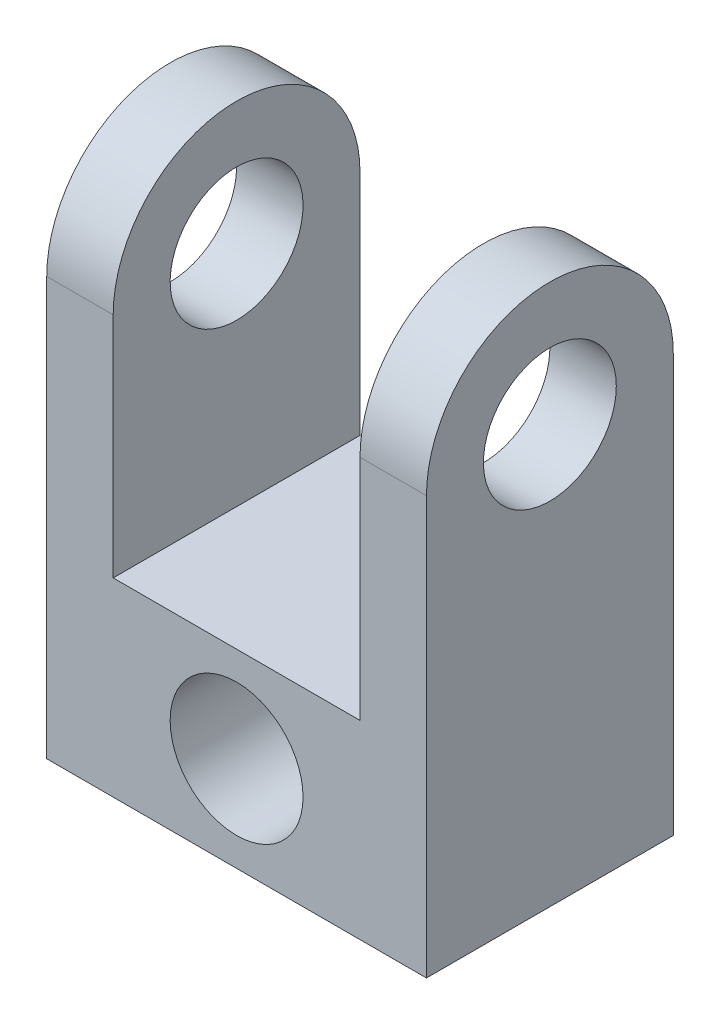
ISO-10303-21;
HEADER;
FILE_DESCRIPTION(('STEP AP214'),'2;1');
FILE_NAME('part.step','',(''),(''),'','','');
FILE_SCHEMA(('AUTOMOTIVE_DESIGN { 1 0 10303 214 1 1 1 1 }'));
ENDSEC;
DATA;
#1=APPLICATION_CONTEXT('core data for automotive mechanical design processes');
#2=APPLICATION_PROTOCOL_DEFINITION('international standard','automotive_design',2000,#1);
#3=PRODUCT_CONTEXT('',#1,'mechanical');
#4=PRODUCT('Part','Part','',(#3));
#5=PRODUCT_RELATED_PRODUCT_CATEGORY('part','',(#4));
#6=PRODUCT_DEFINITION_FORMATION('','',#4);
#7=PRODUCT_DEFINITION_CONTEXT('part definition',#1,'design');
#8=PRODUCT_DEFINITION('design','',#6,#7);
#9=PRODUCT_DEFINITION_SHAPE('','',#8);
#10=(LENGTH_UNIT() NAMED_UNIT(*) SI_UNIT(.MILLI.,.METRE.));
#11=(NAMED_UNIT(*) PLANE_ANGLE_UNIT() SI_UNIT($,.RADIAN.));
#12=(NAMED_UNIT(*) SI_UNIT($,.STERADIAN.) SOLID_ANGLE_UNIT());
#13=UNCERTAINTY_MEASURE_WITH_UNIT(LENGTH_MEASURE(1.E-05),#10,'distance_accuracy_value','');
#14=(GEOMETRIC_REPRESENTATION_CONTEXT(3) GLOBAL_UNCERTAINTY_ASSIGNED_CONTEXT((#13)) GLOBAL_UNIT_ASSIGNED_CONTEXT((#10,
#11,#12)) REPRESENTATION_CONTEXT('',''));
#15=CARTESIAN_POINT('',(0.,0.,0.));
#16=DIRECTION('',(0.,0.,1.));
#17=DIRECTION('',(1.,0.,0.));
#18=AXIS2_PLACEMENT_3D('',#15,#16,#17);
#19=CARTESIAN_POINT('',(10.,0.,0.));
#20=DIRECTION('',(-1.,0.,0.));
#21=DIRECTION('',(0.,0.,1.));
#22=AXIS2_PLACEMENT_3D('',#19,#20,#21);
#23=CYLINDRICAL_SURFACE('',#22,6.5);
#24=CARTESIAN_POINT('',(-6.5,0.,0.));
#25=DIRECTION('',(-1.,0.,0.));
#26=DIRECTION('',(0.,-1.,0.));
#27=AXIS2_PLACEMENT_3D('',#24,#25,#26);
#28=CIRCLE('',#27,6.5);
#29=CARTESIAN_POINT('',(-6.5,0.,6.5));
#30=VERTEX_POINT('',#29);
#31=CARTESIAN_POINT('',(-6.5,0.,-6.5));
#32=VERTEX_POINT('',#31);
#33=EDGE_CURVE('E136',#30,#32,#28,.T.);
#34=ORIENTED_EDGE('',*,*,#33,.T.);
#35=DIRECTION('',(-1.,0.,0.));
#36=VECTOR('',#35,1.);
#37=CARTESIAN_POINT('',(10.,0.,-6.5));
#38=LINE('',#37,#36);
#39=CARTESIAN_POINT('',(-10.,0.,-6.5));
#40=VERTEX_POINT('',#39);
#41=EDGE_CURVE('E79',#32,#40,#38,.T.);
#42=ORIENTED_EDGE('',*,*,#41,.T.);
#43=CARTESIAN_POINT('',(-10.,0.,0.));
#44=DIRECTION('',(1.,0.,0.));
#45=DIRECTION('',(0.,0.,-1.));
#46=AXIS2_PLACEMENT_3D('',#43,#44,#45);
#47=CIRCLE('',#46,6.5);
#48=CARTESIAN_POINT('',(-10.,0.,6.5));
#49=VERTEX_POINT('',#48);
#50=EDGE_CURVE('E146',#40,#49,#47,.T.);
#51=ORIENTED_EDGE('',*,*,#50,.T.);
#52=DIRECTION('',(-1.,0.,0.));
#53=VECTOR('',#52,1.);
#54=CARTESIAN_POINT('',(10.,0.,6.5));
#55=LINE('',#54,#53);
#56=EDGE_CURVE('E171',#30,#49,#55,.T.);
#57=ORIENTED_EDGE('',*,*,#56,.F.);
#58=EDGE_LOOP('',(#34,#42,#51,#57));
#59=FACE_BOUND('',#58,.T.);
#60=ADVANCED_FACE('F33',(#59),#23,.T.);
#61=CARTESIAN_POINT('',(10.,0.,0.));
#62=DIRECTION('',(-1.,0.,0.));
#63=DIRECTION('',(0.,0.,1.));
#64=AXIS2_PLACEMENT_3D('',#61,#62,#63);
#65=CYLINDRICAL_SURFACE('',#64,3.5);
#66=CARTESIAN_POINT('',(-6.5,0.,0.));
#67=DIRECTION('',(-1.,0.,0.));
#68=DIRECTION('',(0.,-1.,0.));
#69=AXIS2_PLACEMENT_3D('',#66,#67,#68);
#70=CIRCLE('',#69,3.5);
#71=CARTESIAN_POINT('',(-6.5,-3.5,0.));
#72=VERTEX_POINT('',#71);
#73=EDGE_CURVE('E126',#72,#72,#70,.T.);
#74=ORIENTED_EDGE('',*,*,#73,.F.);
#75=EDGE_LOOP('',(#74));
#76=FACE_BOUND('',#75,.T.);
#77=CARTESIAN_POINT('',(-10.,0.,0.));
#78=DIRECTION('',(1.,0.,0.));
#79=DIRECTION('',(0.,0.,-1.));
#80=AXIS2_PLACEMENT_3D('',#77,#78,#79);
#81=CIRCLE('',#80,3.5);
#82=CARTESIAN_POINT('',(-10.,0.,-3.5));
#83=VERTEX_POINT('',#82);
#84=EDGE_CURVE('E142',#83,#83,#81,.T.);
#85=ORIENTED_EDGE('',*,*,#84,.F.);
#86=EDGE_LOOP('',(#85));
#87=FACE_BOUND('',#86,.T.);
#88=ADVANCED_FACE('F213',(#76,#87),#65,.F.);
#89=CARTESIAN_POINT('',(10.,0.,0.));
#90=DIRECTION('',(1.,0.,0.));
#91=DIRECTION('',(0.,0.,-1.));
#92=AXIS2_PLACEMENT_3D('',#89,#90,#91);
#93=PLANE('',#92);
#94=CARTESIAN_POINT('',(10.,0.,0.));
#95=DIRECTION('',(1.,0.,0.));
#96=DIRECTION('',(0.,0.,-1.));
#97=AXIS2_PLACEMENT_3D('',#94,#95,#96);
#98=CIRCLE('',#97,6.5);
#99=CARTESIAN_POINT('',(10.,0.,-6.5));
#100=VERTEX_POINT('',#99);
#101=CARTESIAN_POINT('',(10.,0.,6.5));
#102=VERTEX_POINT('',#101);
#103=EDGE_CURVE('E149',#100,#102,#98,.T.);
#104=ORIENTED_EDGE('',*,*,#103,.T.);
#105=DIRECTION('',(0.,-1.,0.));
#106=VECTOR('',#105,1.);
#107=CARTESIAN_POINT('',(10.,0.,6.5));
#108=LINE('',#107,#106);
#109=CARTESIAN_POINT('',(10.,-22.,6.5));
#110=VERTEX_POINT('',#109);
#111=EDGE_CURVE('E87',#102,#110,#108,.T.);
#112=ORIENTED_EDGE('',*,*,#111,.T.);
#113=DIRECTION('',(0.,0.,-1.));
#114=VECTOR('',#113,1.);
#115=CARTESIAN_POINT('',(10.,-22.,6.5));
#116=LINE('',#115,#114);
#117=CARTESIAN_POINT('',(10.,-22.,-6.5));
#118=VERTEX_POINT('',#117);
#119=EDGE_CURVE('E153',#110,#118,#116,.T.);
#120=ORIENTED_EDGE('',*,*,#119,.T.);
#121=DIRECTION('',(0.,1.,0.));
#122=VECTOR('',#121,1.);
#123=CARTESIAN_POINT('',(10.,0.,-6.5));
#124=LINE('',#123,#122);
#125=EDGE_CURVE('E57',#118,#100,#124,.T.);
#126=ORIENTED_EDGE('',*,*,#125,.T.);
#127=EDGE_LOOP('',(#104,#112,#120,#126));
#128=FACE_BOUND('',#127,.T.);
#129=CARTESIAN_POINT('',(10.,0.,0.));
#130=DIRECTION('',(1.,0.,0.));
#131=DIRECTION('',(0.,0.,-1.));
#132=AXIS2_PLACEMENT_3D('',#129,#130,#131);
#133=CIRCLE('',#132,3.5);
#134=CARTESIAN_POINT('',(10.,0.,-3.5));
#135=VERTEX_POINT('',#134);
#136=EDGE_CURVE('E143',#135,#135,#133,.T.);
#137=ORIENTED_EDGE('',*,*,#136,.F.);
#138=EDGE_LOOP('',(#137));
#139=FACE_BOUND('',#138,.T.);
#140=ADVANCED_FACE('F184',(#128,#139),#93,.T.);
#141=CARTESIAN_POINT('',(-10.,0.,0.));
#142=DIRECTION('',(1.,0.,0.));
#143=DIRECTION('',(0.,0.,-1.));
#144=AXIS2_PLACEMENT_3D('',#141,#142,#143);
#145=PLANE('',#144);
#146=ORIENTED_EDGE('',*,*,#50,.F.);
#147=DIRECTION('',(0.,1.,0.));
#148=VECTOR('',#147,1.);
#149=CARTESIAN_POINT('',(-10.,0.,-6.5));
#150=LINE('',#149,#148);
#151=CARTESIAN_POINT('',(-10.,-22.,-6.5));
#152=VERTEX_POINT('',#151);
#153=EDGE_CURVE('E151',#152,#40,#150,.T.);
#154=ORIENTED_EDGE('',*,*,#153,.F.);
#155=DIRECTION('',(0.,0.,-1.));
#156=VECTOR('',#155,1.);
#157=CARTESIAN_POINT('',(-10.,-22.,6.5));
#158=LINE('',#157,#156);
#159=CARTESIAN_POINT('',(-10.,-22.,6.5));
#160=VERTEX_POINT('',#159);
#161=EDGE_CURVE('E159',#160,#152,#158,.T.);
#162=ORIENTED_EDGE('',*,*,#161,.F.);
#163=DIRECTION('',(0.,-1.,0.));
#164=VECTOR('',#163,1.);
#165=CARTESIAN_POINT('',(-10.,0.,6.5));
#166=LINE('',#165,#164);
#167=EDGE_CURVE('E157',#49,#160,#166,.T.);
#168=ORIENTED_EDGE('',*,*,#167,.F.);
#169=EDGE_LOOP('',(#146,#154,#162,#168));
#170=FACE_BOUND('',#169,.T.);
#171=ORIENTED_EDGE('',*,*,#84,.T.);
#172=EDGE_LOOP('',(#171));
#173=FACE_BOUND('',#172,.T.);
#174=ADVANCED_FACE('F195',(#170,#173),#145,.F.);
#175=CARTESIAN_POINT('',(6.5,0.,-6.5));
#176=VERTEX_POINT('',#175);
#177=EDGE_CURVE('E162',#100,#176,#38,.T.);
#178=ORIENTED_EDGE('',*,*,#177,.T.);
#179=CARTESIAN_POINT('',(6.5,0.,0.));
#180=DIRECTION('',(1.,0.,0.));
#181=DIRECTION('',(0.,1.,0.));
#182=AXIS2_PLACEMENT_3D('',#179,#180,#181);
#183=CIRCLE('',#182,6.5);
#184=CARTESIAN_POINT('',(6.5,0.,6.5));
#185=VERTEX_POINT('',#184);
#186=EDGE_CURVE('E127',#176,#185,#183,.T.);
#187=ORIENTED_EDGE('',*,*,#186,.T.);
#188=EDGE_CURVE('E41',#102,#185,#55,.T.);
#189=ORIENTED_EDGE('',*,*,#188,.F.);
#190=ORIENTED_EDGE('',*,*,#103,.F.);
#191=EDGE_LOOP('',(#178,#187,#189,#190));
#192=FACE_BOUND('',#191,.T.);
#193=ADVANCED_FACE('F35',(#192),#23,.T.);
#194=CARTESIAN_POINT('',(10.,0.,6.5));
#195=DIRECTION('',(0.,0.,-1.));
#196=DIRECTION('',(0.,1.,0.));
#197=AXIS2_PLACEMENT_3D('',#194,#195,#196);
#198=PLANE('',#197);
#199=CARTESIAN_POINT('',(0.,-17.,6.5));
#200=DIRECTION('',(0.,0.,-1.));
#201=DIRECTION('',(0.,1.,0.));
#202=AXIS2_PLACEMENT_3D('',#199,#200,#201);
#203=CIRCLE('',#202,3.5);
#204=CARTESIAN_POINT('',(0.,-13.5,6.5));
#205=VERTEX_POINT('',#204);
#206=EDGE_CURVE('E139',#205,#205,#203,.T.);
#207=ORIENTED_EDGE('',*,*,#206,.T.);
#208=EDGE_LOOP('',(#207));
#209=FACE_BOUND('',#208,.T.);
#210=DIRECTION('',(-1.,0.,0.));
#211=VECTOR('',#210,1.);
#212=CARTESIAN_POINT('',(10.,-12.,6.5));
#213=LINE('',#212,#211);
#214=CARTESIAN_POINT('',(6.5,-12.,6.5));
#215=VERTEX_POINT('',#214);
#216=CARTESIAN_POINT('',(-6.5,-12.,6.5));
#217=VERTEX_POINT('',#216);
#218=EDGE_CURVE('E107',#215,#217,#213,.T.);
#219=ORIENTED_EDGE('',*,*,#218,.T.);
#220=DIRECTION('',(0.,1.,0.));
#221=VECTOR('',#220,1.);
#222=CARTESIAN_POINT('',(-6.5,0.,6.5));
#223=LINE('',#222,#221);
#224=EDGE_CURVE('E114',#217,#30,#223,.T.);
#225=ORIENTED_EDGE('',*,*,#224,.T.);
#226=ORIENTED_EDGE('',*,*,#56,.T.);
#227=ORIENTED_EDGE('',*,*,#167,.T.);
#228=DIRECTION('',(-1.,0.,0.));
#229=VECTOR('',#228,1.);
#230=CARTESIAN_POINT('',(10.,-22.,6.5));
#231=LINE('',#230,#229);
#232=EDGE_CURVE('E168',#110,#160,#231,.T.);
#233=ORIENTED_EDGE('',*,*,#232,.F.);
#234=ORIENTED_EDGE('',*,*,#111,.F.);
#235=ORIENTED_EDGE('',*,*,#188,.T.);
#236=DIRECTION('',(0.,-1.,0.));
#237=VECTOR('',#236,1.);
#238=CARTESIAN_POINT('',(6.5,0.,6.5));
#239=LINE('',#238,#237);
#240=EDGE_CURVE('E118',#185,#215,#239,.T.);
#241=ORIENTED_EDGE('',*,*,#240,.T.);
#242=EDGE_LOOP('',(#219,#225,#226,#227,#233,#234,#235,#241));
#243=FACE_BOUND('',#242,.T.);
#244=ADVANCED_FACE('F124',(#209,#243),#198,.F.);
#245=CARTESIAN_POINT('',(10.,-22.,6.5));
#246=DIRECTION('',(0.,1.,0.));
#247=DIRECTION('',(0.,0.,1.));
#248=AXIS2_PLACEMENT_3D('',#245,#246,#247);
#249=PLANE('',#248);
#250=ORIENTED_EDGE('',*,*,#161,.T.);
#251=DIRECTION('',(-1.,0.,0.));
#252=VECTOR('',#251,1.);
#253=CARTESIAN_POINT('',(10.,-22.,-6.5));
#254=LINE('',#253,#252);
#255=EDGE_CURVE('E165',#118,#152,#254,.T.);
#256=ORIENTED_EDGE('',*,*,#255,.F.);
#257=ORIENTED_EDGE('',*,*,#119,.F.);
#258=ORIENTED_EDGE('',*,*,#232,.T.);
#259=EDGE_LOOP('',(#250,#256,#257,#258));
#260=FACE_BOUND('',#259,.T.);
#261=ADVANCED_FACE('F191',(#260),#249,.F.);
#262=CARTESIAN_POINT('',(10.,0.,-6.5));
#263=DIRECTION('',(0.,0.,1.));
#264=DIRECTION('',(0.,-1.,0.));
#265=AXIS2_PLACEMENT_3D('',#262,#263,#264);
#266=PLANE('',#265);
#267=ORIENTED_EDGE('',*,*,#41,.F.);
#268=DIRECTION('',(0.,-1.,0.));
#269=VECTOR('',#268,1.);
#270=CARTESIAN_POINT('',(-6.5,0.,-6.5));
#271=LINE('',#270,#269);
#272=CARTESIAN_POINT('',(-6.5,-12.,-6.5));
#273=VERTEX_POINT('',#272);
#274=EDGE_CURVE('E130',#32,#273,#271,.T.);
#275=ORIENTED_EDGE('',*,*,#274,.T.);
#276=DIRECTION('',(1.,0.,0.));
#277=VECTOR('',#276,1.);
#278=CARTESIAN_POINT('',(10.,-12.,-6.5));
#279=LINE('',#278,#277);
#280=CARTESIAN_POINT('',(6.5,-12.,-6.5));
#281=VERTEX_POINT('',#280);
#282=EDGE_CURVE('E11',#273,#281,#279,.T.);
#283=ORIENTED_EDGE('',*,*,#282,.T.);
#284=DIRECTION('',(0.,1.,0.));
#285=VECTOR('',#284,1.);
#286=CARTESIAN_POINT('',(6.5,0.,-6.5));
#287=LINE('',#286,#285);
#288=EDGE_CURVE('E121',#281,#176,#287,.T.);
#289=ORIENTED_EDGE('',*,*,#288,.T.);
#290=ORIENTED_EDGE('',*,*,#177,.F.);
#291=ORIENTED_EDGE('',*,*,#125,.F.);
#292=ORIENTED_EDGE('',*,*,#255,.T.);
#293=ORIENTED_EDGE('',*,*,#153,.T.);
#294=EDGE_LOOP('',(#267,#275,#283,#289,#290,#291,#292,#293));
#295=FACE_BOUND('',#294,.T.);
#296=CARTESIAN_POINT('',(0.,-17.,-6.5));
#297=DIRECTION('',(0.,0.,1.));
#298=DIRECTION('',(0.,-1.,0.));
#299=AXIS2_PLACEMENT_3D('',#296,#297,#298);
#300=CIRCLE('',#299,3.5);
#301=CARTESIAN_POINT('',(0.,-20.5,-6.5));
#302=VERTEX_POINT('',#301);
#303=EDGE_CURVE('E113',#302,#302,#300,.T.);
#304=ORIENTED_EDGE('',*,*,#303,.T.);
#305=EDGE_LOOP('',(#304));
#306=FACE_BOUND('',#305,.T.);
#307=ADVANCED_FACE('F180',(#295,#306),#266,.F.);
#308=CARTESIAN_POINT('',(6.5,0.,0.));
#309=DIRECTION('',(1.,0.,0.));
#310=DIRECTION('',(0.,1.,0.));
#311=AXIS2_PLACEMENT_3D('',#308,#309,#310);
#312=CIRCLE('',#311,3.5);
#313=CARTESIAN_POINT('',(6.5,3.5,0.));
#314=VERTEX_POINT('',#313);
#315=EDGE_CURVE('E122',#314,#314,#312,.T.);
#316=ORIENTED_EDGE('',*,*,#315,.F.);
#317=EDGE_LOOP('',(#316));
#318=FACE_BOUND('',#317,.T.);
#319=ORIENTED_EDGE('',*,*,#136,.T.);
#320=EDGE_LOOP('',(#319));
#321=FACE_BOUND('',#320,.T.);
#322=ADVANCED_FACE('F219',(#318,#321),#65,.F.);
#323=CARTESIAN_POINT('',(0.,-17.,-10.));
#324=DIRECTION('',(0.,0.,1.));
#325=DIRECTION('',(1.,0.,0.));
#326=AXIS2_PLACEMENT_3D('',#323,#324,#325);
#327=CYLINDRICAL_SURFACE('',#326,3.5);
#328=ORIENTED_EDGE('',*,*,#303,.F.);
#329=EDGE_LOOP('',(#328));
#330=FACE_BOUND('',#329,.T.);
#331=ORIENTED_EDGE('',*,*,#206,.F.);
#332=EDGE_LOOP('',(#331));
#333=FACE_BOUND('',#332,.T.);
#334=ADVANCED_FACE('F209',(#330,#333),#327,.F.);
#335=CARTESIAN_POINT('',(-6.5,-12.,-10.));
#336=DIRECTION('',(0.,-1.,0.));
#337=DIRECTION('',(0.,0.,-1.));
#338=AXIS2_PLACEMENT_3D('',#335,#336,#337);
#339=PLANE('',#338);
#340=DIRECTION('',(0.,0.,1.));
#341=VECTOR('',#340,1.);
#342=CARTESIAN_POINT('',(6.5,-12.,-10.));
#343=LINE('',#342,#341);
#344=EDGE_CURVE('E48',#281,#215,#343,.T.);
#345=ORIENTED_EDGE('',*,*,#344,.F.);
#346=ORIENTED_EDGE('',*,*,#282,.F.);
#347=DIRECTION('',(0.,0.,1.));
#348=VECTOR('',#347,1.);
#349=CARTESIAN_POINT('',(-6.5,-12.,-10.));
#350=LINE('',#349,#348);
#351=EDGE_CURVE('E110',#273,#217,#350,.T.);
#352=ORIENTED_EDGE('',*,*,#351,.T.);
#353=ORIENTED_EDGE('',*,*,#218,.F.);
#354=EDGE_LOOP('',(#345,#346,#352,#353));
#355=FACE_BOUND('',#354,.T.);
#356=ADVANCED_FACE('F108',(#355),#339,.F.);
#357=CARTESIAN_POINT('',(-6.5,6.5,-10.));
#358=DIRECTION('',(-1.,0.,0.));
#359=DIRECTION('',(0.,-1.,0.));
#360=AXIS2_PLACEMENT_3D('',#357,#358,#359);
#361=PLANE('',#360);
#362=ORIENTED_EDGE('',*,*,#73,.T.);
#363=EDGE_LOOP('',(#362));
#364=FACE_BOUND('',#363,.T.);
#365=ORIENTED_EDGE('',*,*,#351,.F.);
#366=ORIENTED_EDGE('',*,*,#274,.F.);
#367=ORIENTED_EDGE('',*,*,#33,.F.);
#368=ORIENTED_EDGE('',*,*,#224,.F.);
#369=EDGE_LOOP('',(#365,#366,#367,#368));
#370=FACE_BOUND('',#369,.T.);
#371=ADVANCED_FACE('F200',(#364,#370),#361,.F.);
#372=CARTESIAN_POINT('',(6.5,6.5,-10.));
#373=DIRECTION('',(1.,0.,0.));
#374=DIRECTION('',(0.,1.,0.));
#375=AXIS2_PLACEMENT_3D('',#372,#373,#374);
#376=PLANE('',#375);
#377=ORIENTED_EDGE('',*,*,#315,.T.);
#378=EDGE_LOOP('',(#377));
#379=FACE_BOUND('',#378,.T.);
#380=ORIENTED_EDGE('',*,*,#186,.F.);
#381=ORIENTED_EDGE('',*,*,#288,.F.);
#382=ORIENTED_EDGE('',*,*,#344,.T.);
#383=ORIENTED_EDGE('',*,*,#240,.F.);
#384=EDGE_LOOP('',(#380,#381,#382,#383));
#385=FACE_BOUND('',#384,.T.);
#386=ADVANCED_FACE('F117',(#379,#385),#376,.F.);
#387=CLOSED_SHELL('',(#60,#88,#140,#174,#193,#244,#261,#307,#322,#334,#356,#371,#386));
#388=MANIFOLD_SOLID_BREP('B2',#387);
#389=ADVANCED_BREP_SHAPE_REPRESENTATION('',(#18,#388),#14);
#390=SHAPE_DEFINITION_REPRESENTATION(#9,#389);
ENDSEC;
END-ISO-10303-21;
